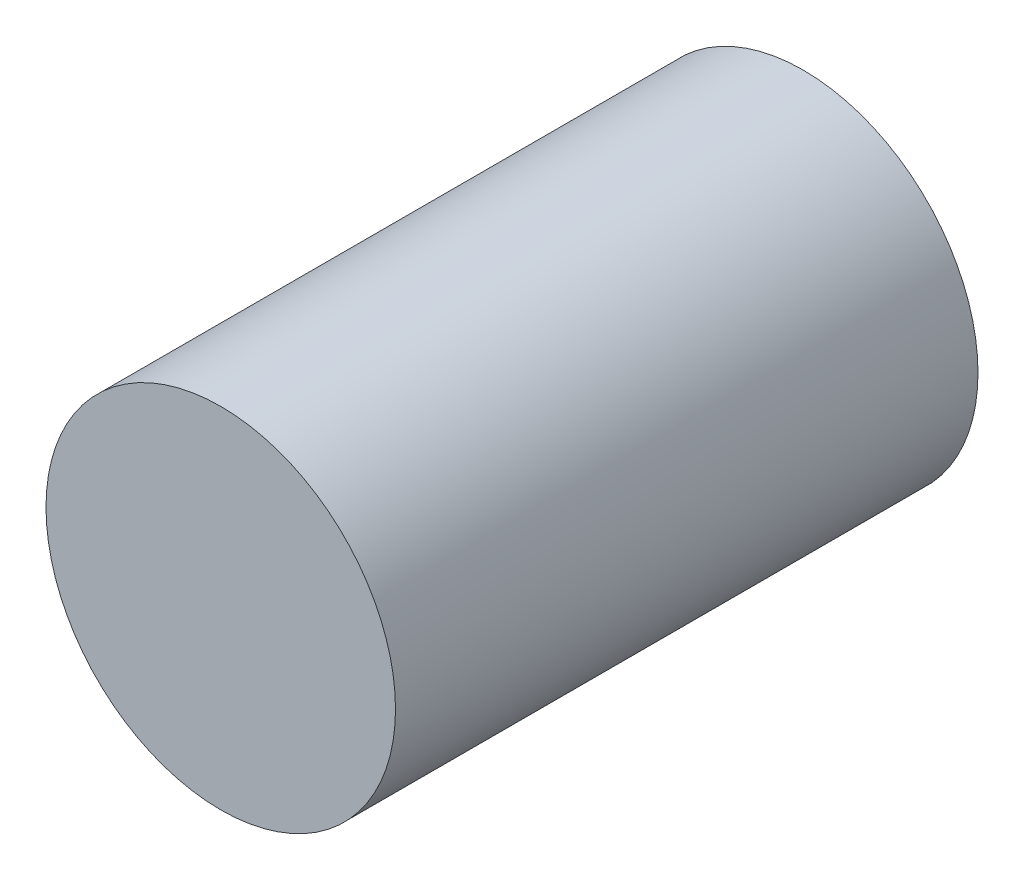
ISO-10303-21;
HEADER;
FILE_DESCRIPTION(('STEP AP214'),'2;1');
FILE_NAME('part.step','',(''),(''),'','','');
FILE_SCHEMA(('AUTOMOTIVE_DESIGN { 1 0 10303 214 1 1 1 1 }'));
ENDSEC;
DATA;
#1=APPLICATION_CONTEXT('core data for automotive mechanical design processes');
#2=APPLICATION_PROTOCOL_DEFINITION('international standard','automotive_design',2000,#1);
#3=PRODUCT_CONTEXT('',#1,'mechanical');
#4=PRODUCT('Part','Part','',(#3));
#5=PRODUCT_RELATED_PRODUCT_CATEGORY('part','',(#4));
#6=PRODUCT_DEFINITION_FORMATION('','',#4);
#7=PRODUCT_DEFINITION_CONTEXT('part definition',#1,'design');
#8=PRODUCT_DEFINITION('design','',#6,#7);
#9=PRODUCT_DEFINITION_SHAPE('','',#8);
#10=(LENGTH_UNIT() NAMED_UNIT(*) SI_UNIT(.MILLI.,.METRE.));
#11=(NAMED_UNIT(*) PLANE_ANGLE_UNIT() SI_UNIT($,.RADIAN.));
#12=(NAMED_UNIT(*) SI_UNIT($,.STERADIAN.) SOLID_ANGLE_UNIT());
#13=UNCERTAINTY_MEASURE_WITH_UNIT(LENGTH_MEASURE(1.E-05),#10,'distance_accuracy_value','');
#14=(GEOMETRIC_REPRESENTATION_CONTEXT(3) GLOBAL_UNCERTAINTY_ASSIGNED_CONTEXT((#13)) GLOBAL_UNIT_ASSIGNED_CONTEXT((#10,
#11,#12)) REPRESENTATION_CONTEXT('',''));
#15=CARTESIAN_POINT('',(0.,0.,0.));
#16=DIRECTION('',(0.,0.,1.));
#17=DIRECTION('',(1.,0.,0.));
#18=AXIS2_PLACEMENT_3D('',#15,#16,#17);
#19=CARTESIAN_POINT('',(0.,0.,10.));
#20=DIRECTION('',(0.,0.,-1.));
#21=DIRECTION('',(-1.,0.,0.));
#22=AXIS2_PLACEMENT_3D('',#19,#20,#21);
#23=CYLINDRICAL_SURFACE('',#22,3.);
#24=CARTESIAN_POINT('',(0.,0.,10.));
#25=DIRECTION('',(0.,0.,1.));
#26=DIRECTION('',(1.,0.,0.));
#27=AXIS2_PLACEMENT_3D('',#24,#25,#26);
#28=CIRCLE('',#27,3.);
#29=CARTESIAN_POINT('',(3.,0.,10.));
#30=VERTEX_POINT('',#29);
#31=EDGE_CURVE('E40',#30,#30,#28,.T.);
#32=ORIENTED_EDGE('',*,*,#31,.F.);
#33=EDGE_LOOP('',(#32));
#34=FACE_BOUND('',#33,.T.);
#35=CARTESIAN_POINT('',(0.,0.,0.));
#36=DIRECTION('',(0.,0.,1.));
#37=DIRECTION('',(1.,0.,0.));
#38=AXIS2_PLACEMENT_3D('',#35,#36,#37);
#39=CIRCLE('',#38,3.);
#40=CARTESIAN_POINT('',(3.,0.,0.));
#41=VERTEX_POINT('',#40);
#42=EDGE_CURVE('E44',#41,#41,#39,.T.);
#43=ORIENTED_EDGE('',*,*,#42,.T.);
#44=EDGE_LOOP('',(#43));
#45=FACE_BOUND('',#44,.T.);
#46=ADVANCED_FACE('F34',(#34,#45),#23,.T.);
#47=CARTESIAN_POINT('',(0.,0.,10.));
#48=DIRECTION('',(0.,0.,1.));
#49=DIRECTION('',(1.,0.,0.));
#50=AXIS2_PLACEMENT_3D('',#47,#48,#49);
#51=PLANE('',#50);
#52=ORIENTED_EDGE('',*,*,#31,.T.);
#53=EDGE_LOOP('',(#52));
#54=FACE_BOUND('',#53,.T.);
#55=ADVANCED_FACE('F69',(#54),#51,.T.);
#56=CARTESIAN_POINT('',(0.,0.,0.));
#57=DIRECTION('',(0.,0.,1.));
#58=DIRECTION('',(1.,0.,0.));
#59=AXIS2_PLACEMENT_3D('',#56,#57,#58);
#60=PLANE('',#59);
#61=CARTESIAN_POINT('',(0.,0.,0.));
#62=DIRECTION('',(0.,0.,1.));
#63=DIRECTION('',(1.,0.,0.));
#64=AXIS2_PLACEMENT_3D('',#61,#62,#63);
#65=CIRCLE('',#64,1.75);
#66=CARTESIAN_POINT('',(1.75,0.,0.));
#67=VERTEX_POINT('',#66);
#68=EDGE_CURVE('E49',#67,#67,#65,.T.);
#69=ORIENTED_EDGE('',*,*,#68,.T.);
#70=EDGE_LOOP('',(#69));
#71=FACE_BOUND('',#70,.T.);
#72=ORIENTED_EDGE('',*,*,#42,.F.);
#73=EDGE_LOOP('',(#72));
#74=FACE_BOUND('',#73,.T.);
#75=ADVANCED_FACE('F54',(#71,#74),#60,.F.);
#76=CARTESIAN_POINT('',(0.,0.,0.5));
#77=DIRECTION('',(0.,0.,-1.));
#78=DIRECTION('',(-1.,0.,0.));
#79=AXIS2_PLACEMENT_3D('',#76,#77,#78);
#80=CYLINDRICAL_SURFACE('',#79,1.75);
#81=CARTESIAN_POINT('',(0.,0.,0.4));
#82=DIRECTION('',(0.,0.,-1.));
#83=DIRECTION('',(-1.,0.,0.));
#84=AXIS2_PLACEMENT_3D('',#81,#82,#83);
#85=CIRCLE('',#84,1.75);
#86=CARTESIAN_POINT('',(-1.75,0.,0.4));
#87=VERTEX_POINT('',#86);
#88=EDGE_CURVE('E10',#87,#87,#85,.T.);
#89=ORIENTED_EDGE('',*,*,#88,.F.);
#90=EDGE_LOOP('',(#89));
#91=FACE_BOUND('',#90,.T.);
#92=ORIENTED_EDGE('',*,*,#68,.F.);
#93=EDGE_LOOP('',(#92));
#94=FACE_BOUND('',#93,.T.);
#95=ADVANCED_FACE('F57',(#91,#94),#80,.F.);
#96=CARTESIAN_POINT('',(0.,0.,0.4));
#97=DIRECTION('',(0.,0.,-1.));
#98=DIRECTION('',(-1.,0.,0.));
#99=AXIS2_PLACEMENT_3D('',#96,#97,#98);
#100=PLANE('',#99);
#101=ORIENTED_EDGE('',*,*,#88,.T.);
#102=EDGE_LOOP('',(#101));
#103=FACE_BOUND('',#102,.T.);
#104=ADVANCED_FACE('F59',(#103),#100,.T.);
#105=CLOSED_SHELL('',(#46,#55,#75,#95,#104));
#106=MANIFOLD_SOLID_BREP('B2',#105);
#107=ADVANCED_BREP_SHAPE_REPRESENTATION('',(#18,#106),#14);
#108=SHAPE_DEFINITION_REPRESENTATION(#9,#107);
ENDSEC;
END-ISO-10303-21;
